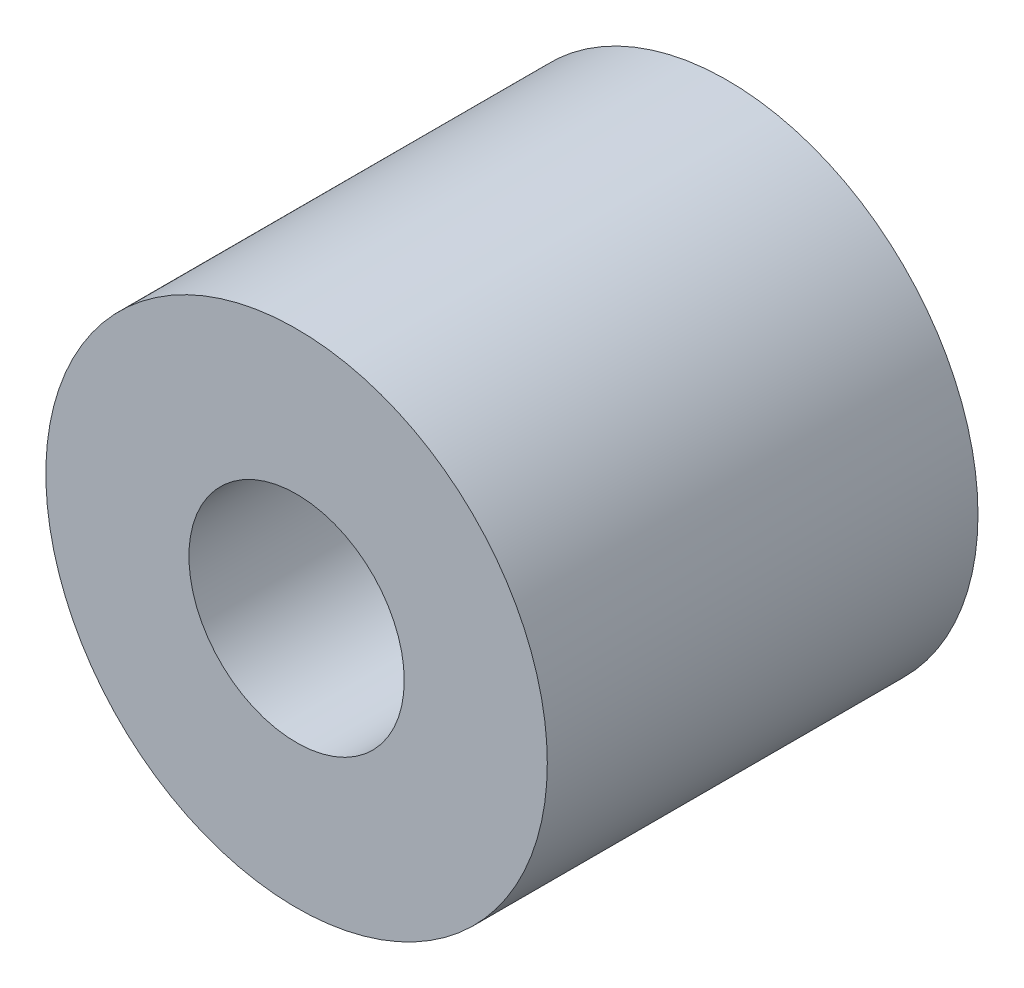
ISO-10303-21;
HEADER;
FILE_DESCRIPTION(('STEP AP214'),'2;1');
FILE_NAME('part.step','',(''),(''),'','','');
FILE_SCHEMA(('AUTOMOTIVE_DESIGN { 1 0 10303 214 1 1 1 1 }'));
ENDSEC;
DATA;
#1=APPLICATION_CONTEXT('core data for automotive mechanical design processes');
#2=APPLICATION_PROTOCOL_DEFINITION('international standard','automotive_design',2000,#1);
#3=PRODUCT_CONTEXT('',#1,'mechanical');
#4=PRODUCT('Part','Part','',(#3));
#5=PRODUCT_RELATED_PRODUCT_CATEGORY('part','',(#4));
#6=PRODUCT_DEFINITION_FORMATION('','',#4);
#7=PRODUCT_DEFINITION_CONTEXT('part definition',#1,'design');
#8=PRODUCT_DEFINITION('design','',#6,#7);
#9=PRODUCT_DEFINITION_SHAPE('','',#8);
#10=(LENGTH_UNIT() NAMED_UNIT(*) SI_UNIT(.MILLI.,.METRE.));
#11=(NAMED_UNIT(*) PLANE_ANGLE_UNIT() SI_UNIT($,.RADIAN.));
#12=(NAMED_UNIT(*) SI_UNIT($,.STERADIAN.) SOLID_ANGLE_UNIT());
#13=UNCERTAINTY_MEASURE_WITH_UNIT(LENGTH_MEASURE(1.E-05),#10,'distance_accuracy_value','');
#14=(GEOMETRIC_REPRESENTATION_CONTEXT(3) GLOBAL_UNCERTAINTY_ASSIGNED_CONTEXT((#13)) GLOBAL_UNIT_ASSIGNED_CONTEXT((#10,
#11,#12)) REPRESENTATION_CONTEXT('',''));
#15=CARTESIAN_POINT('',(0.,0.,0.));
#16=DIRECTION('',(0.,0.,1.));
#17=DIRECTION('',(1.,0.,0.));
#18=AXIS2_PLACEMENT_3D('',#15,#16,#17);
#19=CARTESIAN_POINT('',(0.,0.,-25.4));
#20=DIRECTION('',(0.,0.,1.));
#21=DIRECTION('',(1.,0.,0.));
#22=AXIS2_PLACEMENT_3D('',#19,#20,#21);
#23=CYLINDRICAL_SURFACE('',#22,14.7875);
#24=CARTESIAN_POINT('',(0.,0.,-25.4));
#25=DIRECTION('',(0.,0.,1.));
#26=DIRECTION('',(1.,0.,0.));
#27=AXIS2_PLACEMENT_3D('',#24,#25,#26);
#28=CIRCLE('',#27,14.7875);
#29=CARTESIAN_POINT('',(14.7875,0.,-25.4));
#30=VERTEX_POINT('',#29);
#31=EDGE_CURVE('E10',#30,#30,#28,.T.);
#32=ORIENTED_EDGE('',*,*,#31,.T.);
#33=EDGE_LOOP('',(#32));
#34=FACE_BOUND('',#33,.T.);
#35=CARTESIAN_POINT('',(0.,0.,0.));
#36=DIRECTION('',(0.,0.,1.));
#37=DIRECTION('',(1.,0.,0.));
#38=AXIS2_PLACEMENT_3D('',#35,#36,#37);
#39=CIRCLE('',#38,14.7875);
#40=CARTESIAN_POINT('',(14.7875,0.,0.));
#41=VERTEX_POINT('',#40);
#42=EDGE_CURVE('E46',#41,#41,#39,.T.);
#43=ORIENTED_EDGE('',*,*,#42,.F.);
#44=EDGE_LOOP('',(#43));
#45=FACE_BOUND('',#44,.T.);
#46=ADVANCED_FACE('F43',(#34,#45),#23,.T.);
#47=CARTESIAN_POINT('',(0.,0.,-25.4));
#48=DIRECTION('',(0.,0.,1.));
#49=DIRECTION('',(1.,0.,0.));
#50=AXIS2_PLACEMENT_3D('',#47,#48,#49);
#51=PLANE('',#50);
#52=CARTESIAN_POINT('',(0.,0.,-25.4));
#53=DIRECTION('',(0.,0.,1.));
#54=DIRECTION('',(1.,0.,0.));
#55=AXIS2_PLACEMENT_3D('',#52,#53,#54);
#56=CIRCLE('',#55,6.35);
#57=CARTESIAN_POINT('',(6.35,0.,-25.4));
#58=VERTEX_POINT('',#57);
#59=EDGE_CURVE('E55',#58,#58,#56,.T.);
#60=ORIENTED_EDGE('',*,*,#59,.T.);
#61=EDGE_LOOP('',(#60));
#62=FACE_BOUND('',#61,.T.);
#63=ORIENTED_EDGE('',*,*,#31,.F.);
#64=EDGE_LOOP('',(#63));
#65=FACE_BOUND('',#64,.T.);
#66=ADVANCED_FACE('F65',(#62,#65),#51,.F.);
#67=CARTESIAN_POINT('',(0.,0.,0.));
#68=DIRECTION('',(0.,0.,1.));
#69=DIRECTION('',(1.,0.,0.));
#70=AXIS2_PLACEMENT_3D('',#67,#68,#69);
#71=PLANE('',#70);
#72=CARTESIAN_POINT('',(0.,0.,0.));
#73=DIRECTION('',(0.,0.,1.));
#74=DIRECTION('',(1.,0.,0.));
#75=AXIS2_PLACEMENT_3D('',#72,#73,#74);
#76=CIRCLE('',#75,6.35);
#77=CARTESIAN_POINT('',(6.35,0.,0.));
#78=VERTEX_POINT('',#77);
#79=EDGE_CURVE('E57',#78,#78,#76,.T.);
#80=ORIENTED_EDGE('',*,*,#79,.F.);
#81=EDGE_LOOP('',(#80));
#82=FACE_BOUND('',#81,.T.);
#83=ORIENTED_EDGE('',*,*,#42,.T.);
#84=EDGE_LOOP('',(#83));
#85=FACE_BOUND('',#84,.T.);
#86=ADVANCED_FACE('F71',(#82,#85),#71,.T.);
#87=CARTESIAN_POINT('',(0.,0.,-25.4));
#88=DIRECTION('',(0.,0.,1.));
#89=DIRECTION('',(1.,0.,0.));
#90=AXIS2_PLACEMENT_3D('',#87,#88,#89);
#91=CYLINDRICAL_SURFACE('',#90,6.35);
#92=ORIENTED_EDGE('',*,*,#59,.F.);
#93=EDGE_LOOP('',(#92));
#94=FACE_BOUND('',#93,.T.);
#95=ORIENTED_EDGE('',*,*,#79,.T.);
#96=EDGE_LOOP('',(#95));
#97=FACE_BOUND('',#96,.T.);
#98=ADVANCED_FACE('F68',(#94,#97),#91,.F.);
#99=CLOSED_SHELL('',(#46,#66,#86,#98));
#100=MANIFOLD_SOLID_BREP('B2',#99);
#101=ADVANCED_BREP_SHAPE_REPRESENTATION('',(#18,#100),#14);
#102=SHAPE_DEFINITION_REPRESENTATION(#9,#101);
ENDSEC;
END-ISO-10303-21;
